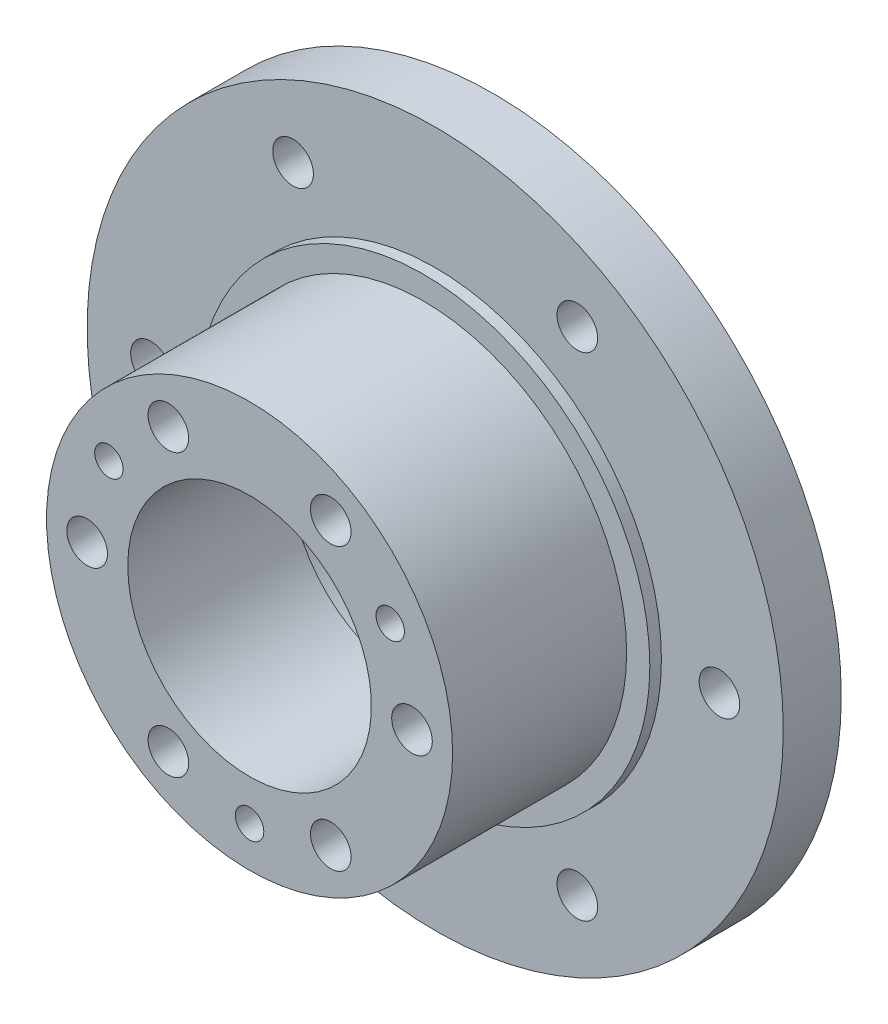
ISO-10303-21;
HEADER;
FILE_DESCRIPTION(('STEP AP214'),'2;1');
FILE_NAME('part.step','',(''),(''),'','','');
FILE_SCHEMA(('AUTOMOTIVE_DESIGN { 1 0 10303 214 1 1 1 1 }'));
ENDSEC;
DATA;
#1=APPLICATION_CONTEXT('core data for automotive mechanical design processes');
#2=APPLICATION_PROTOCOL_DEFINITION('international standard','automotive_design',2000,#1);
#3=PRODUCT_CONTEXT('',#1,'mechanical');
#4=PRODUCT('Part','Part','',(#3));
#5=PRODUCT_RELATED_PRODUCT_CATEGORY('part','',(#4));
#6=PRODUCT_DEFINITION_FORMATION('','',#4);
#7=PRODUCT_DEFINITION_CONTEXT('part definition',#1,'design');
#8=PRODUCT_DEFINITION('design','',#6,#7);
#9=PRODUCT_DEFINITION_SHAPE('','',#8);
#10=(LENGTH_UNIT() NAMED_UNIT(*) SI_UNIT(.MILLI.,.METRE.));
#11=(NAMED_UNIT(*) PLANE_ANGLE_UNIT() SI_UNIT($,.RADIAN.));
#12=(NAMED_UNIT(*) SI_UNIT($,.STERADIAN.) SOLID_ANGLE_UNIT());
#13=UNCERTAINTY_MEASURE_WITH_UNIT(LENGTH_MEASURE(1.E-05),#10,'distance_accuracy_value','');
#14=(GEOMETRIC_REPRESENTATION_CONTEXT(3) GLOBAL_UNCERTAINTY_ASSIGNED_CONTEXT((#13)) GLOBAL_UNIT_ASSIGNED_CONTEXT((#10,
#11,#12)) REPRESENTATION_CONTEXT('',''));
#15=CARTESIAN_POINT('',(0.,0.,0.));
#16=DIRECTION('',(0.,0.,1.));
#17=DIRECTION('',(1.,0.,0.));
#18=AXIS2_PLACEMENT_3D('',#15,#16,#17);
#19=CARTESIAN_POINT('',(0.,0.,5.));
#20=DIRECTION('',(0.,0.,-1.));
#21=DIRECTION('',(-1.,0.,0.));
#22=AXIS2_PLACEMENT_3D('',#19,#20,#21);
#23=CYLINDRICAL_SURFACE('',#22,30.);
#24=CARTESIAN_POINT('',(0.,0.,5.));
#25=DIRECTION('',(0.,0.,1.));
#26=DIRECTION('',(1.,0.,0.));
#27=AXIS2_PLACEMENT_3D('',#24,#25,#26);
#28=CIRCLE('',#27,30.);
#29=CARTESIAN_POINT('',(30.,0.,5.));
#30=VERTEX_POINT('',#29);
#31=EDGE_CURVE('E51',#30,#30,#28,.T.);
#32=ORIENTED_EDGE('',*,*,#31,.F.);
#33=EDGE_LOOP('',(#32));
#34=FACE_BOUND('',#33,.T.);
#35=CARTESIAN_POINT('',(0.,0.,0.));
#36=DIRECTION('',(0.,0.,1.));
#37=DIRECTION('',(1.,0.,0.));
#38=AXIS2_PLACEMENT_3D('',#35,#36,#37);
#39=CIRCLE('',#38,30.);
#40=CARTESIAN_POINT('',(30.,0.,0.));
#41=VERTEX_POINT('',#40);
#42=EDGE_CURVE('E40',#41,#41,#39,.T.);
#43=ORIENTED_EDGE('',*,*,#42,.T.);
#44=EDGE_LOOP('',(#43));
#45=FACE_BOUND('',#44,.T.);
#46=ADVANCED_FACE('F37',(#34,#45),#23,.T.);
#47=CARTESIAN_POINT('',(0.,0.,5.));
#48=DIRECTION('',(0.,0.,1.));
#49=DIRECTION('',(1.,0.,0.));
#50=AXIS2_PLACEMENT_3D('',#47,#48,#49);
#51=PLANE('',#50);
#52=CARTESIAN_POINT('',(24.5,0.,5.));
#53=DIRECTION('',(0.,0.,1.));
#54=DIRECTION('',(1.,0.,0.));
#55=AXIS2_PLACEMENT_3D('',#52,#53,#54);
#56=CIRCLE('',#55,1.75);
#57=CARTESIAN_POINT('',(26.25,0.,5.));
#58=VERTEX_POINT('',#57);
#59=EDGE_CURVE('E468',#58,#58,#56,.T.);
#60=ORIENTED_EDGE('',*,*,#59,.F.);
#61=EDGE_LOOP('',(#60));
#62=FACE_BOUND('',#61,.T.);
#63=CARTESIAN_POINT('',(12.2500000000002,21.2176223927186,5.));
#64=DIRECTION('',(0.,0.,1.));
#65=DIRECTION('',(1.,0.,0.));
#66=AXIS2_PLACEMENT_3D('',#63,#64,#65);
#67=CIRCLE('',#66,1.75);
#68=CARTESIAN_POINT('',(14.0000000000002,21.2176223927186,5.));
#69=VERTEX_POINT('',#68);
#70=EDGE_CURVE('E469',#69,#69,#67,.T.);
#71=ORIENTED_EDGE('',*,*,#70,.F.);
#72=EDGE_LOOP('',(#71));
#73=FACE_BOUND('',#72,.T.);
#74=CARTESIAN_POINT('',(-12.2499999999998,21.2176223927189,5.));
#75=DIRECTION('',(0.,0.,1.));
#76=DIRECTION('',(1.,0.,0.));
#77=AXIS2_PLACEMENT_3D('',#74,#75,#76);
#78=CIRCLE('',#77,1.75);
#79=CARTESIAN_POINT('',(-10.4999999999998,21.2176223927189,5.));
#80=VERTEX_POINT('',#79);
#81=EDGE_CURVE('E435',#80,#80,#78,.T.);
#82=ORIENTED_EDGE('',*,*,#81,.F.);
#83=EDGE_LOOP('',(#82));
#84=FACE_BOUND('',#83,.T.);
#85=CARTESIAN_POINT('',(-24.5,1.71082585603314E-13,5.));
#86=DIRECTION('',(0.,0.,1.));
#87=DIRECTION('',(1.,0.,0.));
#88=AXIS2_PLACEMENT_3D('',#85,#86,#87);
#89=CIRCLE('',#88,1.75);
#90=CARTESIAN_POINT('',(-22.75,1.71082585603314E-13,5.));
#91=VERTEX_POINT('',#90);
#92=EDGE_CURVE('E444',#91,#91,#89,.T.);
#93=ORIENTED_EDGE('',*,*,#92,.F.);
#94=EDGE_LOOP('',(#93));
#95=FACE_BOUND('',#94,.T.);
#96=CARTESIAN_POINT('',(-12.2500000000001,-21.2176223927187,5.));
#97=DIRECTION('',(0.,0.,1.));
#98=DIRECTION('',(1.,0.,0.));
#99=AXIS2_PLACEMENT_3D('',#96,#97,#98);
#100=CIRCLE('',#99,1.75);
#101=CARTESIAN_POINT('',(-10.5000000000001,-21.2176223927187,5.));
#102=VERTEX_POINT('',#101);
#103=EDGE_CURVE('E452',#102,#102,#100,.T.);
#104=ORIENTED_EDGE('',*,*,#103,.F.);
#105=EDGE_LOOP('',(#104));
#106=FACE_BOUND('',#105,.T.);
#107=CARTESIAN_POINT('',(12.25,-21.2176223927188,5.));
#108=DIRECTION('',(0.,0.,1.));
#109=DIRECTION('',(1.,0.,0.));
#110=AXIS2_PLACEMENT_3D('',#107,#108,#109);
#111=CIRCLE('',#110,1.75);
#112=CARTESIAN_POINT('',(14.,-21.2176223927188,5.));
#113=VERTEX_POINT('',#112);
#114=EDGE_CURVE('E460',#113,#113,#111,.T.);
#115=ORIENTED_EDGE('',*,*,#114,.F.);
#116=EDGE_LOOP('',(#115));
#117=FACE_BOUND('',#116,.T.);
#118=CARTESIAN_POINT('',(0.,0.,5.));
#119=DIRECTION('',(0.,0.,1.));
#120=DIRECTION('',(1.,0.,0.));
#121=AXIS2_PLACEMENT_3D('',#118,#119,#120);
#122=CIRCLE('',#121,19.5);
#123=CARTESIAN_POINT('',(19.5,0.,5.));
#124=VERTEX_POINT('',#123);
#125=EDGE_CURVE('E45',#124,#124,#122,.T.);
#126=ORIENTED_EDGE('',*,*,#125,.F.);
#127=EDGE_LOOP('',(#126));
#128=FACE_BOUND('',#127,.T.);
#129=ORIENTED_EDGE('',*,*,#31,.T.);
#130=EDGE_LOOP('',(#129));
#131=FACE_BOUND('',#130,.T.);
#132=ADVANCED_FACE('F72',(#62,#73,#84,#95,#106,#117,#128,#131),#51,.T.);
#133=CARTESIAN_POINT('',(0.,0.,0.));
#134=DIRECTION('',(0.,0.,1.));
#135=DIRECTION('',(1.,0.,0.));
#136=AXIS2_PLACEMENT_3D('',#133,#134,#135);
#137=PLANE('',#136);
#138=CARTESIAN_POINT('',(24.5,0.,0.));
#139=DIRECTION('',(0.,0.,1.));
#140=DIRECTION('',(1.,0.,0.));
#141=AXIS2_PLACEMENT_3D('',#138,#139,#140);
#142=CIRCLE('',#141,1.75);
#143=CARTESIAN_POINT('',(26.25,0.,0.));
#144=VERTEX_POINT('',#143);
#145=EDGE_CURVE('E431',#144,#144,#142,.T.);
#146=ORIENTED_EDGE('',*,*,#145,.T.);
#147=EDGE_LOOP('',(#146));
#148=FACE_BOUND('',#147,.T.);
#149=CARTESIAN_POINT('',(12.2500000000002,21.2176223927186,0.));
#150=DIRECTION('',(0.,0.,1.));
#151=DIRECTION('',(1.,0.,0.));
#152=AXIS2_PLACEMENT_3D('',#149,#150,#151);
#153=CIRCLE('',#152,1.75);
#154=CARTESIAN_POINT('',(14.0000000000002,21.2176223927186,0.));
#155=VERTEX_POINT('',#154);
#156=EDGE_CURVE('E440',#155,#155,#153,.T.);
#157=ORIENTED_EDGE('',*,*,#156,.T.);
#158=EDGE_LOOP('',(#157));
#159=FACE_BOUND('',#158,.T.);
#160=CARTESIAN_POINT('',(-12.2499999999998,21.2176223927189,0.));
#161=DIRECTION('',(0.,0.,1.));
#162=DIRECTION('',(1.,0.,0.));
#163=AXIS2_PLACEMENT_3D('',#160,#161,#162);
#164=CIRCLE('',#163,1.75);
#165=CARTESIAN_POINT('',(-10.4999999999998,21.2176223927189,0.));
#166=VERTEX_POINT('',#165);
#167=EDGE_CURVE('E439',#166,#166,#164,.T.);
#168=ORIENTED_EDGE('',*,*,#167,.T.);
#169=EDGE_LOOP('',(#168));
#170=FACE_BOUND('',#169,.T.);
#171=CARTESIAN_POINT('',(-24.5,1.71082585603314E-13,0.));
#172=DIRECTION('',(0.,0.,1.));
#173=DIRECTION('',(1.,0.,0.));
#174=AXIS2_PLACEMENT_3D('',#171,#172,#173);
#175=CIRCLE('',#174,1.75);
#176=CARTESIAN_POINT('',(-22.75,1.71082585603314E-13,0.));
#177=VERTEX_POINT('',#176);
#178=EDGE_CURVE('E448',#177,#177,#175,.T.);
#179=ORIENTED_EDGE('',*,*,#178,.T.);
#180=EDGE_LOOP('',(#179));
#181=FACE_BOUND('',#180,.T.);
#182=CARTESIAN_POINT('',(-12.2500000000001,-21.2176223927187,0.));
#183=DIRECTION('',(0.,0.,1.));
#184=DIRECTION('',(1.,0.,0.));
#185=AXIS2_PLACEMENT_3D('',#182,#183,#184);
#186=CIRCLE('',#185,1.75);
#187=CARTESIAN_POINT('',(-10.5000000000001,-21.2176223927187,0.));
#188=VERTEX_POINT('',#187);
#189=EDGE_CURVE('E456',#188,#188,#186,.T.);
#190=ORIENTED_EDGE('',*,*,#189,.T.);
#191=EDGE_LOOP('',(#190));
#192=FACE_BOUND('',#191,.T.);
#193=CARTESIAN_POINT('',(12.25,-21.2176223927188,0.));
#194=DIRECTION('',(0.,0.,1.));
#195=DIRECTION('',(1.,0.,0.));
#196=AXIS2_PLACEMENT_3D('',#193,#194,#195);
#197=CIRCLE('',#196,1.75);
#198=CARTESIAN_POINT('',(14.,-21.2176223927188,0.));
#199=VERTEX_POINT('',#198);
#200=EDGE_CURVE('E464',#199,#199,#197,.T.);
#201=ORIENTED_EDGE('',*,*,#200,.T.);
#202=EDGE_LOOP('',(#201));
#203=FACE_BOUND('',#202,.T.);
#204=CARTESIAN_POINT('',(0.,0.,0.));
#205=DIRECTION('',(0.,0.,-1.));
#206=DIRECTION('',(-1.,0.,0.));
#207=AXIS2_PLACEMENT_3D('',#204,#205,#206);
#208=CIRCLE('',#207,12.025);
#209=CARTESIAN_POINT('',(-12.025,0.,0.));
#210=VERTEX_POINT('',#209);
#211=EDGE_CURVE('E419',#210,#210,#208,.T.);
#212=ORIENTED_EDGE('',*,*,#211,.F.);
#213=EDGE_LOOP('',(#212));
#214=FACE_BOUND('',#213,.T.);
#215=ORIENTED_EDGE('',*,*,#42,.F.);
#216=EDGE_LOOP('',(#215));
#217=FACE_BOUND('',#216,.T.);
#218=ADVANCED_FACE('F69',(#148,#159,#170,#181,#192,#203,#214,#217),#137,.F.);
#219=CARTESIAN_POINT('',(0.,0.,6.));
#220=DIRECTION('',(0.,0.,-1.));
#221=DIRECTION('',(-1.,0.,0.));
#222=AXIS2_PLACEMENT_3D('',#219,#220,#221);
#223=CYLINDRICAL_SURFACE('',#222,19.5);
#224=CARTESIAN_POINT('',(0.,0.,6.));
#225=DIRECTION('',(0.,0.,1.));
#226=DIRECTION('',(1.,0.,0.));
#227=AXIS2_PLACEMENT_3D('',#224,#225,#226);
#228=CIRCLE('',#227,19.5);
#229=CARTESIAN_POINT('',(19.5,0.,6.));
#230=VERTEX_POINT('',#229);
#231=EDGE_CURVE('E57',#230,#230,#228,.T.);
#232=ORIENTED_EDGE('',*,*,#231,.F.);
#233=EDGE_LOOP('',(#232));
#234=FACE_BOUND('',#233,.T.);
#235=ORIENTED_EDGE('',*,*,#125,.T.);
#236=EDGE_LOOP('',(#235));
#237=FACE_BOUND('',#236,.T.);
#238=ADVANCED_FACE('F71',(#234,#237),#223,.T.);
#239=CARTESIAN_POINT('',(0.,0.,6.));
#240=DIRECTION('',(0.,0.,1.));
#241=DIRECTION('',(1.,0.,0.));
#242=AXIS2_PLACEMENT_3D('',#239,#240,#241);
#243=PLANE('',#242);
#244=CARTESIAN_POINT('',(0.,0.,6.));
#245=DIRECTION('',(0.,0.,1.));
#246=DIRECTION('',(1.,0.,0.));
#247=AXIS2_PLACEMENT_3D('',#244,#245,#246);
#248=CIRCLE('',#247,17.5);
#249=CARTESIAN_POINT('',(17.5,0.,6.));
#250=VERTEX_POINT('',#249);
#251=EDGE_CURVE('E10',#250,#250,#248,.T.);
#252=ORIENTED_EDGE('',*,*,#251,.F.);
#253=EDGE_LOOP('',(#252));
#254=FACE_BOUND('',#253,.T.);
#255=ORIENTED_EDGE('',*,*,#231,.T.);
#256=EDGE_LOOP('',(#255));
#257=FACE_BOUND('',#256,.T.);
#258=ADVANCED_FACE('F78',(#254,#257),#243,.T.);
#259=CARTESIAN_POINT('',(0.,0.,21.));
#260=DIRECTION('',(0.,0.,-1.));
#261=DIRECTION('',(-1.,0.,0.));
#262=AXIS2_PLACEMENT_3D('',#259,#260,#261);
#263=CYLINDRICAL_SURFACE('',#262,17.5);
#264=CARTESIAN_POINT('',(0.,0.,21.));
#265=DIRECTION('',(0.,0.,1.));
#266=DIRECTION('',(1.,0.,0.));
#267=AXIS2_PLACEMENT_3D('',#264,#265,#266);
#268=CIRCLE('',#267,17.5);
#269=CARTESIAN_POINT('',(17.5,0.,21.));
#270=VERTEX_POINT('',#269);
#271=EDGE_CURVE('E55',#270,#270,#268,.T.);
#272=ORIENTED_EDGE('',*,*,#271,.F.);
#273=EDGE_LOOP('',(#272));
#274=FACE_BOUND('',#273,.T.);
#275=ORIENTED_EDGE('',*,*,#251,.T.);
#276=EDGE_LOOP('',(#275));
#277=FACE_BOUND('',#276,.T.);
#278=ADVANCED_FACE('F299',(#274,#277),#263,.T.);
#279=CARTESIAN_POINT('',(0.,0.,21.));
#280=DIRECTION('',(0.,0.,1.));
#281=DIRECTION('',(1.,0.,0.));
#282=AXIS2_PLACEMENT_3D('',#279,#280,#281);
#283=PLANE('',#282);
#284=CARTESIAN_POINT('',(12.1243556529821,7.00000000000002,21.));
#285=DIRECTION('',(0.,0.,1.));
#286=DIRECTION('',(1.,0.,0.));
#287=AXIS2_PLACEMENT_3D('',#284,#285,#286);
#288=CIRCLE('',#287,1.225);
#289=CARTESIAN_POINT('',(13.3493556529821,7.00000000000002,21.));
#290=VERTEX_POINT('',#289);
#291=EDGE_CURVE('E546',#290,#290,#288,.T.);
#292=ORIENTED_EDGE('',*,*,#291,.F.);
#293=EDGE_LOOP('',(#292));
#294=FACE_BOUND('',#293,.T.);
#295=CARTESIAN_POINT('',(5.86982504876221E-13,-14.0000000000003,21.));
#296=DIRECTION('',(0.,0.,1.));
#297=DIRECTION('',(1.,0.,0.));
#298=AXIS2_PLACEMENT_3D('',#295,#296,#297);
#299=CIRCLE('',#298,1.22499999999981);
#300=CARTESIAN_POINT('',(1.22500000000039,-14.0000000000003,21.));
#301=VERTEX_POINT('',#300);
#302=EDGE_CURVE('E538',#301,#301,#299,.T.);
#303=ORIENTED_EDGE('',*,*,#302,.F.);
#304=EDGE_LOOP('',(#303));
#305=FACE_BOUND('',#304,.T.);
#306=CARTESIAN_POINT('',(-12.1243556529822,6.99999999999932,21.));
#307=DIRECTION('',(0.,0.,1.));
#308=DIRECTION('',(1.,0.,0.));
#309=AXIS2_PLACEMENT_3D('',#306,#307,#308);
#310=CIRCLE('',#309,1.22500000000048);
#311=CARTESIAN_POINT('',(-10.8993556529817,6.99999999999932,21.));
#312=VERTEX_POINT('',#311);
#313=EDGE_CURVE('E530',#312,#312,#310,.T.);
#314=ORIENTED_EDGE('',*,*,#313,.F.);
#315=EDGE_LOOP('',(#314));
#316=FACE_BOUND('',#315,.T.);
#317=CARTESIAN_POINT('',(14.,0.,21.));
#318=DIRECTION('',(0.,0.,1.));
#319=DIRECTION('',(1.,0.,0.));
#320=AXIS2_PLACEMENT_3D('',#317,#318,#319);
#321=CIRCLE('',#320,1.75);
#322=CARTESIAN_POINT('',(15.75,0.,21.));
#323=VERTEX_POINT('',#322);
#324=EDGE_CURVE('E515',#323,#323,#321,.T.);
#325=ORIENTED_EDGE('',*,*,#324,.F.);
#326=EDGE_LOOP('',(#325));
#327=FACE_BOUND('',#326,.T.);
#328=CARTESIAN_POINT('',(7.00000000000014,12.1243556529821,21.));
#329=DIRECTION('',(0.,0.,1.));
#330=DIRECTION('',(1.,0.,0.));
#331=AXIS2_PLACEMENT_3D('',#328,#329,#330);
#332=CIRCLE('',#331,1.75);
#333=CARTESIAN_POINT('',(8.75000000000014,12.1243556529821,21.));
#334=VERTEX_POINT('',#333);
#335=EDGE_CURVE('E516',#334,#334,#332,.T.);
#336=ORIENTED_EDGE('',*,*,#335,.F.);
#337=EDGE_LOOP('',(#336));
#338=FACE_BOUND('',#337,.T.);
#339=CARTESIAN_POINT('',(-6.99999999999989,12.1243556529822,21.));
#340=DIRECTION('',(0.,0.,1.));
#341=DIRECTION('',(1.,0.,0.));
#342=AXIS2_PLACEMENT_3D('',#339,#340,#341);
#343=CIRCLE('',#342,1.75);
#344=CARTESIAN_POINT('',(-5.24999999999989,12.1243556529822,21.));
#345=VERTEX_POINT('',#344);
#346=EDGE_CURVE('E482',#345,#345,#343,.T.);
#347=ORIENTED_EDGE('',*,*,#346,.F.);
#348=EDGE_LOOP('',(#347));
#349=FACE_BOUND('',#348,.T.);
#350=CARTESIAN_POINT('',(-14.,0.,21.));
#351=DIRECTION('',(0.,0.,1.));
#352=DIRECTION('',(1.,0.,0.));
#353=AXIS2_PLACEMENT_3D('',#350,#351,#352);
#354=CIRCLE('',#353,1.75);
#355=CARTESIAN_POINT('',(-12.25,0.,21.));
#356=VERTEX_POINT('',#355);
#357=EDGE_CURVE('E491',#356,#356,#354,.T.);
#358=ORIENTED_EDGE('',*,*,#357,.F.);
#359=EDGE_LOOP('',(#358));
#360=FACE_BOUND('',#359,.T.);
#361=CARTESIAN_POINT('',(-7.00000000000006,-12.1243556529821,21.));
#362=DIRECTION('',(0.,0.,1.));
#363=DIRECTION('',(1.,0.,0.));
#364=AXIS2_PLACEMENT_3D('',#361,#362,#363);
#365=CIRCLE('',#364,1.75);
#366=CARTESIAN_POINT('',(-5.25000000000006,-12.1243556529821,21.));
#367=VERTEX_POINT('',#366);
#368=EDGE_CURVE('E499',#367,#367,#365,.T.);
#369=ORIENTED_EDGE('',*,*,#368,.F.);
#370=EDGE_LOOP('',(#369));
#371=FACE_BOUND('',#370,.T.);
#372=CARTESIAN_POINT('',(6.99999999999997,-12.1243556529822,21.));
#373=DIRECTION('',(0.,0.,1.));
#374=DIRECTION('',(1.,0.,0.));
#375=AXIS2_PLACEMENT_3D('',#372,#373,#374);
#376=CIRCLE('',#375,1.75);
#377=CARTESIAN_POINT('',(8.74999999999997,-12.1243556529822,21.));
#378=VERTEX_POINT('',#377);
#379=EDGE_CURVE('E507',#378,#378,#376,.T.);
#380=ORIENTED_EDGE('',*,*,#379,.F.);
#381=EDGE_LOOP('',(#380));
#382=FACE_BOUND('',#381,.T.);
#383=CARTESIAN_POINT('',(0.,0.,21.));
#384=DIRECTION('',(0.,0.,-1.));
#385=DIRECTION('',(-1.,0.,0.));
#386=AXIS2_PLACEMENT_3D('',#383,#384,#385);
#387=CIRCLE('',#386,10.5);
#388=CARTESIAN_POINT('',(-10.5,0.,21.));
#389=VERTEX_POINT('',#388);
#390=EDGE_CURVE('E425',#389,#389,#387,.T.);
#391=ORIENTED_EDGE('',*,*,#390,.T.);
#392=EDGE_LOOP('',(#391));
#393=FACE_BOUND('',#392,.T.);
#394=ORIENTED_EDGE('',*,*,#271,.T.);
#395=EDGE_LOOP('',(#394));
#396=FACE_BOUND('',#395,.T.);
#397=ADVANCED_FACE('F293',(#294,#305,#316,#327,#338,#349,#360,#371,#382,#393,#396),#283,.T.);
#398=CARTESIAN_POINT('',(0.,0.,7.));
#399=DIRECTION('',(0.,0.,-1.));
#400=DIRECTION('',(-1.,0.,0.));
#401=AXIS2_PLACEMENT_3D('',#398,#399,#400);
#402=CYLINDRICAL_SURFACE('',#401,12.025);
#403=CARTESIAN_POINT('',(0.,0.,7.));
#404=DIRECTION('',(0.,0.,-1.));
#405=DIRECTION('',(-1.,0.,0.));
#406=AXIS2_PLACEMENT_3D('',#403,#404,#405);
#407=CIRCLE('',#406,12.025);
#408=CARTESIAN_POINT('',(-12.025,0.,7.));
#409=VERTEX_POINT('',#408);
#410=EDGE_CURVE('E416',#409,#409,#407,.T.);
#411=ORIENTED_EDGE('',*,*,#410,.F.);
#412=EDGE_LOOP('',(#411));
#413=FACE_BOUND('',#412,.T.);
#414=ORIENTED_EDGE('',*,*,#211,.T.);
#415=EDGE_LOOP('',(#414));
#416=FACE_BOUND('',#415,.T.);
#417=ADVANCED_FACE('F298',(#413,#416),#402,.F.);
#418=CARTESIAN_POINT('',(0.,0.,7.));
#419=DIRECTION('',(0.,0.,-1.));
#420=DIRECTION('',(-1.,0.,0.));
#421=AXIS2_PLACEMENT_3D('',#418,#419,#420);
#422=PLANE('',#421);
#423=CARTESIAN_POINT('',(0.,0.,7.));
#424=DIRECTION('',(0.,0.,-1.));
#425=DIRECTION('',(-1.,0.,0.));
#426=AXIS2_PLACEMENT_3D('',#423,#424,#425);
#427=CIRCLE('',#426,10.5);
#428=CARTESIAN_POINT('',(-10.5,0.,7.));
#429=VERTEX_POINT('',#428);
#430=EDGE_CURVE('E427',#429,#429,#427,.T.);
#431=ORIENTED_EDGE('',*,*,#430,.F.);
#432=EDGE_LOOP('',(#431));
#433=FACE_BOUND('',#432,.T.);
#434=ORIENTED_EDGE('',*,*,#410,.T.);
#435=EDGE_LOOP('',(#434));
#436=FACE_BOUND('',#435,.T.);
#437=ADVANCED_FACE('F368',(#433,#436),#422,.T.);
#438=CARTESIAN_POINT('',(0.,0.,21.));
#439=DIRECTION('',(0.,0.,-1.));
#440=DIRECTION('',(-1.,0.,0.));
#441=AXIS2_PLACEMENT_3D('',#438,#439,#440);
#442=CYLINDRICAL_SURFACE('',#441,10.5);
#443=CARTESIAN_POINT('',(-10.5,0.,21.));
#444=CARTESIAN_POINT('',(-10.5,0.,20.8541666666667));
#445=CARTESIAN_POINT('',(-10.5,0.,20.7083333333333));
#446=CARTESIAN_POINT('',(-10.5,0.,20.4166666666667));
#447=CARTESIAN_POINT('',(-10.5,0.,20.2708333333333));
#448=CARTESIAN_POINT('',(-10.5,0.,19.9791666666667));
#449=CARTESIAN_POINT('',(-10.5,0.,19.8333333333333));
#450=CARTESIAN_POINT('',(-10.5,0.,19.5416666666667));
#451=CARTESIAN_POINT('',(-10.5,0.,19.3958333333333));
#452=CARTESIAN_POINT('',(-10.5,0.,19.1041666666667));
#453=CARTESIAN_POINT('',(-10.5,0.,18.9583333333333));
#454=CARTESIAN_POINT('',(-10.5,0.,18.6666666666667));
#455=CARTESIAN_POINT('',(-10.5,0.,18.5208333333333));
#456=CARTESIAN_POINT('',(-10.5,0.,18.2291666666667));
#457=CARTESIAN_POINT('',(-10.5,0.,18.0833333333333));
#458=CARTESIAN_POINT('',(-10.5,0.,17.7916666666667));
#459=CARTESIAN_POINT('',(-10.5,0.,17.6458333333333));
#460=CARTESIAN_POINT('',(-10.5,0.,17.3541666666667));
#461=CARTESIAN_POINT('',(-10.5,0.,17.2083333333333));
#462=CARTESIAN_POINT('',(-10.5,0.,16.9166666666667));
#463=CARTESIAN_POINT('',(-10.5,0.,16.7708333333333));
#464=CARTESIAN_POINT('',(-10.5,0.,16.4791666666667));
#465=CARTESIAN_POINT('',(-10.5,0.,16.3333333333333));
#466=CARTESIAN_POINT('',(-10.5,0.,16.0416666666667));
#467=CARTESIAN_POINT('',(-10.5,0.,15.8958333333333));
#468=CARTESIAN_POINT('',(-10.5,0.,15.6041666666667));
#469=CARTESIAN_POINT('',(-10.5,0.,15.4583333333333));
#470=CARTESIAN_POINT('',(-10.5,0.,15.1666666666667));
#471=CARTESIAN_POINT('',(-10.5,0.,15.0208333333333));
#472=CARTESIAN_POINT('',(-10.5,0.,14.7291666666667));
#473=CARTESIAN_POINT('',(-10.5,0.,14.5833333333333));
#474=CARTESIAN_POINT('',(-10.5,0.,14.2916666666667));
#475=CARTESIAN_POINT('',(-10.5,0.,14.1458333333333));
#476=CARTESIAN_POINT('',(-10.5,0.,13.8541666666667));
#477=CARTESIAN_POINT('',(-10.5,0.,13.7083333333333));
#478=CARTESIAN_POINT('',(-10.5,0.,13.4166666666667));
#479=CARTESIAN_POINT('',(-10.5,0.,13.2708333333333));
#480=CARTESIAN_POINT('',(-10.5,0.,12.9791666666667));
#481=CARTESIAN_POINT('',(-10.5,0.,12.8333333333333));
#482=CARTESIAN_POINT('',(-10.5,0.,12.5416666666667));
#483=CARTESIAN_POINT('',(-10.5,0.,12.3958333333333));
#484=CARTESIAN_POINT('',(-10.5,0.,12.1041666666667));
#485=CARTESIAN_POINT('',(-10.5,0.,11.9583333333333));
#486=CARTESIAN_POINT('',(-10.5,0.,11.6666666666667));
#487=CARTESIAN_POINT('',(-10.5,0.,11.5208333333333));
#488=CARTESIAN_POINT('',(-10.5,0.,11.2291666666667));
#489=CARTESIAN_POINT('',(-10.5,0.,11.0833333333333));
#490=CARTESIAN_POINT('',(-10.5,0.,10.7916666666667));
#491=CARTESIAN_POINT('',(-10.5,0.,10.6458333333333));
#492=CARTESIAN_POINT('',(-10.5,0.,10.3541666666667));
#493=CARTESIAN_POINT('',(-10.5,0.,10.2083333333333));
#494=CARTESIAN_POINT('',(-10.5,0.,9.91666666666667));
#495=CARTESIAN_POINT('',(-10.5,0.,9.77083333333333));
#496=CARTESIAN_POINT('',(-10.5,0.,9.47916666666667));
#497=CARTESIAN_POINT('',(-10.5,0.,9.33333333333333));
#498=CARTESIAN_POINT('',(-10.5,0.,9.04166666666667));
#499=CARTESIAN_POINT('',(-10.5,0.,8.89583333333333));
#500=CARTESIAN_POINT('',(-10.5,0.,8.60416666666667));
#501=CARTESIAN_POINT('',(-10.5,0.,8.45833333333333));
#502=CARTESIAN_POINT('',(-10.5,0.,8.16666666666667));
#503=CARTESIAN_POINT('',(-10.5,0.,8.02083333333333));
#504=CARTESIAN_POINT('',(-10.5,0.,7.72916666666667));
#505=CARTESIAN_POINT('',(-10.5,0.,7.58333333333333));
#506=CARTESIAN_POINT('',(-10.5,0.,7.29166666666667));
#507=CARTESIAN_POINT('',(-10.5,0.,7.14583333333333));
#508=CARTESIAN_POINT('',(-10.5,0.,7.));
#509=B_SPLINE_CURVE_WITH_KNOTS('',3,(#443,#444,#445,#446,#447,#448,#449,#450,#451,#452,#453,
#454,#455,#456,#457,#458,#459,#460,#461,#462,#463,#464,#465,#466,#467,#468,#469,#470,#471,#472,
#473,#474,#475,#476,#477,#478,#479,#480,#481,#482,#483,#484,#485,#486,#487,#488,#489,#490,#491,
#492,#493,#494,#495,#496,#497,#498,#499,#500,#501,#502,#503,#504,#505,#506,#507,#508),
.UNSPECIFIED.,.F.,.F.,(4,2,2,2,2,2,2,2,2,2,2,2,2,2,2,2,2,2,2,2,2,2,2,2,2,2,2,2,2,2,2,2,4),(0.,
0.4375,0.875000000000001,1.3125,1.75,2.1875,2.625,3.0625,3.5,3.9375,4.375,4.8125,5.25,5.6875,
6.125,6.5625,7.,7.4375,7.875,8.3125,8.75,9.1875,9.625,10.0625,10.5,10.9375,11.375,11.8125,12.25,
12.6875,13.125,13.5625,14.),.UNSPECIFIED.);
#510=EDGE_CURVE('BSEAM100',#389,#429,#509,.T.);
#511=ORIENTED_EDGE('',*,*,#390,.F.);
#512=ORIENTED_EDGE('',*,*,#430,.T.);
#513=ORIENTED_EDGE('',*,*,#510,.T.);
#514=ORIENTED_EDGE('',*,*,#510,.F.);
#515=EDGE_LOOP('',(#511,#513,#512,#514));
#516=FACE_BOUND('',#515,.T.);
#517=ADVANCED_FACE('F100',(#516),#442,.F.);
#518=CARTESIAN_POINT('',(12.25,-21.2176223927188,0.));
#519=DIRECTION('',(0.,0.,1.));
#520=DIRECTION('',(1.,0.,0.));
#521=AXIS2_PLACEMENT_3D('',#518,#519,#520);
#522=CYLINDRICAL_SURFACE('',#521,1.75);
#523=ORIENTED_EDGE('',*,*,#200,.F.);
#524=EDGE_LOOP('',(#523));
#525=FACE_BOUND('',#524,.T.);
#526=ORIENTED_EDGE('',*,*,#114,.T.);
#527=EDGE_LOOP('',(#526));
#528=FACE_BOUND('',#527,.T.);
#529=ADVANCED_FACE('F110',(#525,#528),#522,.F.);
#530=CARTESIAN_POINT('',(-12.2500000000001,-21.2176223927187,0.));
#531=DIRECTION('',(0.,0.,1.));
#532=DIRECTION('',(1.,0.,0.));
#533=AXIS2_PLACEMENT_3D('',#530,#531,#532);
#534=CYLINDRICAL_SURFACE('',#533,1.75);
#535=ORIENTED_EDGE('',*,*,#189,.F.);
#536=EDGE_LOOP('',(#535));
#537=FACE_BOUND('',#536,.T.);
#538=ORIENTED_EDGE('',*,*,#103,.T.);
#539=EDGE_LOOP('',(#538));
#540=FACE_BOUND('',#539,.T.);
#541=ADVANCED_FACE('F115',(#537,#540),#534,.F.);
#542=CARTESIAN_POINT('',(-24.5,1.71082585603314E-13,0.));
#543=DIRECTION('',(0.,0.,1.));
#544=DIRECTION('',(1.,0.,0.));
#545=AXIS2_PLACEMENT_3D('',#542,#543,#544);
#546=CYLINDRICAL_SURFACE('',#545,1.75);
#547=ORIENTED_EDGE('',*,*,#178,.F.);
#548=EDGE_LOOP('',(#547));
#549=FACE_BOUND('',#548,.T.);
#550=ORIENTED_EDGE('',*,*,#92,.T.);
#551=EDGE_LOOP('',(#550));
#552=FACE_BOUND('',#551,.T.);
#553=ADVANCED_FACE('F125',(#549,#552),#546,.F.);
#554=CARTESIAN_POINT('',(-12.2499999999998,21.2176223927189,0.));
#555=DIRECTION('',(0.,0.,1.));
#556=DIRECTION('',(1.,0.,0.));
#557=AXIS2_PLACEMENT_3D('',#554,#555,#556);
#558=CYLINDRICAL_SURFACE('',#557,1.75);
#559=ORIENTED_EDGE('',*,*,#167,.F.);
#560=EDGE_LOOP('',(#559));
#561=FACE_BOUND('',#560,.T.);
#562=ORIENTED_EDGE('',*,*,#81,.T.);
#563=EDGE_LOOP('',(#562));
#564=FACE_BOUND('',#563,.T.);
#565=ADVANCED_FACE('F135',(#561,#564),#558,.F.);
#566=CARTESIAN_POINT('',(12.2500000000002,21.2176223927186,0.));
#567=DIRECTION('',(0.,0.,1.));
#568=DIRECTION('',(1.,0.,0.));
#569=AXIS2_PLACEMENT_3D('',#566,#567,#568);
#570=CYLINDRICAL_SURFACE('',#569,1.75);
#571=ORIENTED_EDGE('',*,*,#156,.F.);
#572=EDGE_LOOP('',(#571));
#573=FACE_BOUND('',#572,.T.);
#574=ORIENTED_EDGE('',*,*,#70,.T.);
#575=EDGE_LOOP('',(#574));
#576=FACE_BOUND('',#575,.T.);
#577=ADVANCED_FACE('F145',(#573,#576),#570,.F.);
#578=CARTESIAN_POINT('',(24.5,0.,0.));
#579=DIRECTION('',(0.,0.,1.));
#580=DIRECTION('',(1.,0.,0.));
#581=AXIS2_PLACEMENT_3D('',#578,#579,#580);
#582=CYLINDRICAL_SURFACE('',#581,1.75);
#583=ORIENTED_EDGE('',*,*,#145,.F.);
#584=EDGE_LOOP('',(#583));
#585=FACE_BOUND('',#584,.T.);
#586=ORIENTED_EDGE('',*,*,#59,.T.);
#587=EDGE_LOOP('',(#586));
#588=FACE_BOUND('',#587,.T.);
#589=ADVANCED_FACE('F155',(#585,#588),#582,.F.);
#590=CARTESIAN_POINT('',(6.99999999999997,-12.1243556529822,11.));
#591=DIRECTION('',(0.,0.,1.));
#592=DIRECTION('',(1.,0.,0.));
#593=AXIS2_PLACEMENT_3D('',#590,#591,#592);
#594=CYLINDRICAL_SURFACE('',#593,1.75);
#595=CARTESIAN_POINT('',(6.99999999999997,-12.1243556529822,11.));
#596=DIRECTION('',(0.,0.,1.));
#597=DIRECTION('',(1.,0.,0.));
#598=AXIS2_PLACEMENT_3D('',#595,#596,#597);
#599=CIRCLE('',#598,1.75);
#600=CARTESIAN_POINT('',(8.74999999999997,-12.1243556529822,11.));
#601=VERTEX_POINT('',#600);
#602=EDGE_CURVE('E511',#601,#601,#599,.T.);
#603=ORIENTED_EDGE('',*,*,#602,.F.);
#604=EDGE_LOOP('',(#603));
#605=FACE_BOUND('',#604,.T.);
#606=ORIENTED_EDGE('',*,*,#379,.T.);
#607=EDGE_LOOP('',(#606));
#608=FACE_BOUND('',#607,.T.);
#609=ADVANCED_FACE('F165',(#605,#608),#594,.F.);
#610=CARTESIAN_POINT('',(6.99999999999997,-12.1243556529822,11.));
#611=DIRECTION('',(0.,0.,1.));
#612=DIRECTION('',(1.,0.,0.));
#613=AXIS2_PLACEMENT_3D('',#610,#611,#612);
#614=PLANE('',#613);
#615=ORIENTED_EDGE('',*,*,#602,.T.);
#616=EDGE_LOOP('',(#615));
#617=FACE_BOUND('',#616,.T.);
#618=ADVANCED_FACE('F175',(#617),#614,.T.);
#619=CARTESIAN_POINT('',(-7.00000000000006,-12.1243556529821,11.));
#620=DIRECTION('',(0.,0.,1.));
#621=DIRECTION('',(1.,0.,0.));
#622=AXIS2_PLACEMENT_3D('',#619,#620,#621);
#623=CYLINDRICAL_SURFACE('',#622,1.75);
#624=CARTESIAN_POINT('',(-7.00000000000006,-12.1243556529821,11.));
#625=DIRECTION('',(0.,0.,1.));
#626=DIRECTION('',(1.,0.,0.));
#627=AXIS2_PLACEMENT_3D('',#624,#625,#626);
#628=CIRCLE('',#627,1.75);
#629=CARTESIAN_POINT('',(-5.25000000000006,-12.1243556529821,11.));
#630=VERTEX_POINT('',#629);
#631=EDGE_CURVE('E503',#630,#630,#628,.T.);
#632=ORIENTED_EDGE('',*,*,#631,.F.);
#633=EDGE_LOOP('',(#632));
#634=FACE_BOUND('',#633,.T.);
#635=ORIENTED_EDGE('',*,*,#368,.T.);
#636=EDGE_LOOP('',(#635));
#637=FACE_BOUND('',#636,.T.);
#638=ADVANCED_FACE('F185',(#634,#637),#623,.F.);
#639=CARTESIAN_POINT('',(-7.00000000000006,-12.1243556529821,11.));
#640=DIRECTION('',(0.,0.,1.));
#641=DIRECTION('',(1.,0.,0.));
#642=AXIS2_PLACEMENT_3D('',#639,#640,#641);
#643=PLANE('',#642);
#644=ORIENTED_EDGE('',*,*,#631,.T.);
#645=EDGE_LOOP('',(#644));
#646=FACE_BOUND('',#645,.T.);
#647=ADVANCED_FACE('F195',(#646),#643,.T.);
#648=CARTESIAN_POINT('',(-14.,0.,11.));
#649=DIRECTION('',(0.,0.,1.));
#650=DIRECTION('',(1.,0.,0.));
#651=AXIS2_PLACEMENT_3D('',#648,#649,#650);
#652=CYLINDRICAL_SURFACE('',#651,1.75);
#653=CARTESIAN_POINT('',(-14.,0.,11.));
#654=DIRECTION('',(0.,0.,1.));
#655=DIRECTION('',(1.,0.,0.));
#656=AXIS2_PLACEMENT_3D('',#653,#654,#655);
#657=CIRCLE('',#656,1.75);
#658=CARTESIAN_POINT('',(-12.25,0.,11.));
#659=VERTEX_POINT('',#658);
#660=EDGE_CURVE('E495',#659,#659,#657,.T.);
#661=ORIENTED_EDGE('',*,*,#660,.F.);
#662=EDGE_LOOP('',(#661));
#663=FACE_BOUND('',#662,.T.);
#664=ORIENTED_EDGE('',*,*,#357,.T.);
#665=EDGE_LOOP('',(#664));
#666=FACE_BOUND('',#665,.T.);
#667=ADVANCED_FACE('F205',(#663,#666),#652,.F.);
#668=CARTESIAN_POINT('',(-14.,0.,11.));
#669=DIRECTION('',(0.,0.,1.));
#670=DIRECTION('',(1.,0.,0.));
#671=AXIS2_PLACEMENT_3D('',#668,#669,#670);
#672=PLANE('',#671);
#673=ORIENTED_EDGE('',*,*,#660,.T.);
#674=EDGE_LOOP('',(#673));
#675=FACE_BOUND('',#674,.T.);
#676=ADVANCED_FACE('F215',(#675),#672,.T.);
#677=CARTESIAN_POINT('',(-6.99999999999989,12.1243556529822,11.));
#678=DIRECTION('',(0.,0.,1.));
#679=DIRECTION('',(1.,0.,0.));
#680=AXIS2_PLACEMENT_3D('',#677,#678,#679);
#681=CYLINDRICAL_SURFACE('',#680,1.75);
#682=CARTESIAN_POINT('',(-6.99999999999989,12.1243556529822,11.));
#683=DIRECTION('',(0.,0.,1.));
#684=DIRECTION('',(1.,0.,0.));
#685=AXIS2_PLACEMENT_3D('',#682,#683,#684);
#686=CIRCLE('',#685,1.75);
#687=CARTESIAN_POINT('',(-5.24999999999989,12.1243556529822,11.));
#688=VERTEX_POINT('',#687);
#689=EDGE_CURVE('E486',#688,#688,#686,.T.);
#690=ORIENTED_EDGE('',*,*,#689,.F.);
#691=EDGE_LOOP('',(#690));
#692=FACE_BOUND('',#691,.T.);
#693=ORIENTED_EDGE('',*,*,#346,.T.);
#694=EDGE_LOOP('',(#693));
#695=FACE_BOUND('',#694,.T.);
#696=ADVANCED_FACE('F225',(#692,#695),#681,.F.);
#697=CARTESIAN_POINT('',(-6.99999999999989,12.1243556529822,11.));
#698=DIRECTION('',(0.,0.,1.));
#699=DIRECTION('',(1.,0.,0.));
#700=AXIS2_PLACEMENT_3D('',#697,#698,#699);
#701=PLANE('',#700);
#702=ORIENTED_EDGE('',*,*,#689,.T.);
#703=EDGE_LOOP('',(#702));
#704=FACE_BOUND('',#703,.T.);
#705=ADVANCED_FACE('F235',(#704),#701,.T.);
#706=CARTESIAN_POINT('',(7.00000000000014,12.1243556529821,11.));
#707=DIRECTION('',(0.,0.,1.));
#708=DIRECTION('',(1.,0.,0.));
#709=AXIS2_PLACEMENT_3D('',#706,#707,#708);
#710=CYLINDRICAL_SURFACE('',#709,1.75);
#711=CARTESIAN_POINT('',(7.00000000000014,12.1243556529821,11.));
#712=DIRECTION('',(0.,0.,1.));
#713=DIRECTION('',(1.,0.,0.));
#714=AXIS2_PLACEMENT_3D('',#711,#712,#713);
#715=CIRCLE('',#714,1.75);
#716=CARTESIAN_POINT('',(8.75000000000014,12.1243556529821,11.));
#717=VERTEX_POINT('',#716);
#718=EDGE_CURVE('E487',#717,#717,#715,.T.);
#719=ORIENTED_EDGE('',*,*,#718,.F.);
#720=EDGE_LOOP('',(#719));
#721=FACE_BOUND('',#720,.T.);
#722=ORIENTED_EDGE('',*,*,#335,.T.);
#723=EDGE_LOOP('',(#722));
#724=FACE_BOUND('',#723,.T.);
#725=ADVANCED_FACE('F245',(#721,#724),#710,.F.);
#726=CARTESIAN_POINT('',(7.00000000000014,12.1243556529821,11.));
#727=DIRECTION('',(0.,0.,1.));
#728=DIRECTION('',(1.,0.,0.));
#729=AXIS2_PLACEMENT_3D('',#726,#727,#728);
#730=PLANE('',#729);
#731=ORIENTED_EDGE('',*,*,#718,.T.);
#732=EDGE_LOOP('',(#731));
#733=FACE_BOUND('',#732,.T.);
#734=ADVANCED_FACE('F255',(#733),#730,.T.);
#735=CARTESIAN_POINT('',(14.,0.,11.));
#736=DIRECTION('',(0.,0.,1.));
#737=DIRECTION('',(1.,0.,0.));
#738=AXIS2_PLACEMENT_3D('',#735,#736,#737);
#739=CYLINDRICAL_SURFACE('',#738,1.75);
#740=CARTESIAN_POINT('',(14.,0.,11.));
#741=DIRECTION('',(0.,0.,1.));
#742=DIRECTION('',(1.,0.,0.));
#743=AXIS2_PLACEMENT_3D('',#740,#741,#742);
#744=CIRCLE('',#743,1.75);
#745=CARTESIAN_POINT('',(15.75,0.,11.));
#746=VERTEX_POINT('',#745);
#747=EDGE_CURVE('E473',#746,#746,#744,.T.);
#748=ORIENTED_EDGE('',*,*,#747,.F.);
#749=EDGE_LOOP('',(#748));
#750=FACE_BOUND('',#749,.T.);
#751=ORIENTED_EDGE('',*,*,#324,.T.);
#752=EDGE_LOOP('',(#751));
#753=FACE_BOUND('',#752,.T.);
#754=ADVANCED_FACE('F265',(#750,#753),#739,.F.);
#755=CARTESIAN_POINT('',(14.,0.,11.));
#756=DIRECTION('',(0.,0.,1.));
#757=DIRECTION('',(1.,0.,0.));
#758=AXIS2_PLACEMENT_3D('',#755,#756,#757);
#759=PLANE('',#758);
#760=ORIENTED_EDGE('',*,*,#747,.T.);
#761=EDGE_LOOP('',(#760));
#762=FACE_BOUND('',#761,.T.);
#763=ADVANCED_FACE('F275',(#762),#759,.T.);
#764=CARTESIAN_POINT('',(-12.1243556529822,6.99999999999932,9.));
#765=DIRECTION('',(0.,0.,1.));
#766=DIRECTION('',(1.,0.,0.));
#767=AXIS2_PLACEMENT_3D('',#764,#765,#766);
#768=CYLINDRICAL_SURFACE('',#767,1.22500000000048);
#769=CARTESIAN_POINT('',(-12.1243556529822,6.99999999999932,9.));
#770=DIRECTION('',(0.,0.,1.));
#771=DIRECTION('',(1.,0.,0.));
#772=AXIS2_PLACEMENT_3D('',#769,#770,#771);
#773=CIRCLE('',#772,1.22500000000048);
#774=CARTESIAN_POINT('',(-10.8993556529817,6.99999999999932,9.));
#775=VERTEX_POINT('',#774);
#776=EDGE_CURVE('E534',#775,#775,#773,.T.);
#777=ORIENTED_EDGE('',*,*,#776,.F.);
#778=EDGE_LOOP('',(#777));
#779=FACE_BOUND('',#778,.T.);
#780=ORIENTED_EDGE('',*,*,#313,.T.);
#781=EDGE_LOOP('',(#780));
#782=FACE_BOUND('',#781,.T.);
#783=ADVANCED_FACE('F285',(#779,#782),#768,.F.);
#784=CARTESIAN_POINT('',(-12.1243556529822,6.99999999999932,9.));
#785=DIRECTION('',(0.,0.,1.));
#786=DIRECTION('',(1.,0.,0.));
#787=AXIS2_PLACEMENT_3D('',#784,#785,#786);
#788=PLANE('',#787);
#789=ORIENTED_EDGE('',*,*,#776,.T.);
#790=EDGE_LOOP('',(#789));
#791=FACE_BOUND('',#790,.T.);
#792=ADVANCED_FACE('F311',(#791),#788,.T.);
#793=CARTESIAN_POINT('',(5.86982504876221E-13,-14.0000000000003,9.));
#794=DIRECTION('',(0.,0.,1.));
#795=DIRECTION('',(1.,0.,0.));
#796=AXIS2_PLACEMENT_3D('',#793,#794,#795);
#797=CYLINDRICAL_SURFACE('',#796,1.22499999999981);
#798=CARTESIAN_POINT('',(5.86982504876221E-13,-14.0000000000003,9.));
#799=DIRECTION('',(0.,0.,1.));
#800=DIRECTION('',(1.,0.,0.));
#801=AXIS2_PLACEMENT_3D('',#798,#799,#800);
#802=CIRCLE('',#801,1.22499999999981);
#803=CARTESIAN_POINT('',(1.22500000000039,-14.0000000000003,9.));
#804=VERTEX_POINT('',#803);
#805=EDGE_CURVE('E542',#804,#804,#802,.T.);
#806=ORIENTED_EDGE('',*,*,#805,.F.);
#807=EDGE_LOOP('',(#806));
#808=FACE_BOUND('',#807,.T.);
#809=ORIENTED_EDGE('',*,*,#302,.T.);
#810=EDGE_LOOP('',(#809));
#811=FACE_BOUND('',#810,.T.);
#812=ADVANCED_FACE('F321',(#808,#811),#797,.F.);
#813=CARTESIAN_POINT('',(5.86982504876221E-13,-14.0000000000003,9.));
#814=DIRECTION('',(0.,0.,1.));
#815=DIRECTION('',(1.,0.,0.));
#816=AXIS2_PLACEMENT_3D('',#813,#814,#815);
#817=PLANE('',#816);
#818=ORIENTED_EDGE('',*,*,#805,.T.);
#819=EDGE_LOOP('',(#818));
#820=FACE_BOUND('',#819,.T.);
#821=ADVANCED_FACE('F331',(#820),#817,.T.);
#822=CARTESIAN_POINT('',(12.1243556529821,7.00000000000002,9.));
#823=DIRECTION('',(0.,0.,1.));
#824=DIRECTION('',(1.,0.,0.));
#825=AXIS2_PLACEMENT_3D('',#822,#823,#824);
#826=CYLINDRICAL_SURFACE('',#825,1.225);
#827=CARTESIAN_POINT('',(12.1243556529821,7.00000000000002,9.));
#828=DIRECTION('',(0.,0.,1.));
#829=DIRECTION('',(1.,0.,0.));
#830=AXIS2_PLACEMENT_3D('',#827,#828,#829);
#831=CIRCLE('',#830,1.225);
#832=CARTESIAN_POINT('',(13.3493556529821,7.00000000000002,9.));
#833=VERTEX_POINT('',#832);
#834=EDGE_CURVE('E520',#833,#833,#831,.T.);
#835=ORIENTED_EDGE('',*,*,#834,.F.);
#836=EDGE_LOOP('',(#835));
#837=FACE_BOUND('',#836,.T.);
#838=ORIENTED_EDGE('',*,*,#291,.T.);
#839=EDGE_LOOP('',(#838));
#840=FACE_BOUND('',#839,.T.);
#841=ADVANCED_FACE('F341',(#837,#840),#826,.F.);
#842=CARTESIAN_POINT('',(12.1243556529821,7.00000000000002,9.));
#843=DIRECTION('',(0.,0.,1.));
#844=DIRECTION('',(1.,0.,0.));
#845=AXIS2_PLACEMENT_3D('',#842,#843,#844);
#846=PLANE('',#845);
#847=ORIENTED_EDGE('',*,*,#834,.T.);
#848=EDGE_LOOP('',(#847));
#849=FACE_BOUND('',#848,.T.);
#850=ADVANCED_FACE('F351',(#849),#846,.T.);
#851=CLOSED_SHELL('',(#46,#132,#218,#238,#258,#278,#397,#417,#437,#517,#529,#541,#553,#565,#577,
#589,#609,#618,#638,#647,#667,#676,#696,#705,#725,#734,#754,#763,#783,#792,#812,#821,#841,#850));
#852=MANIFOLD_SOLID_BREP('B2',#851);
#853=ADVANCED_BREP_SHAPE_REPRESENTATION('',(#18,#852),#14);
#854=SHAPE_DEFINITION_REPRESENTATION(#9,#853);
ENDSEC;
END-ISO-10303-21;
